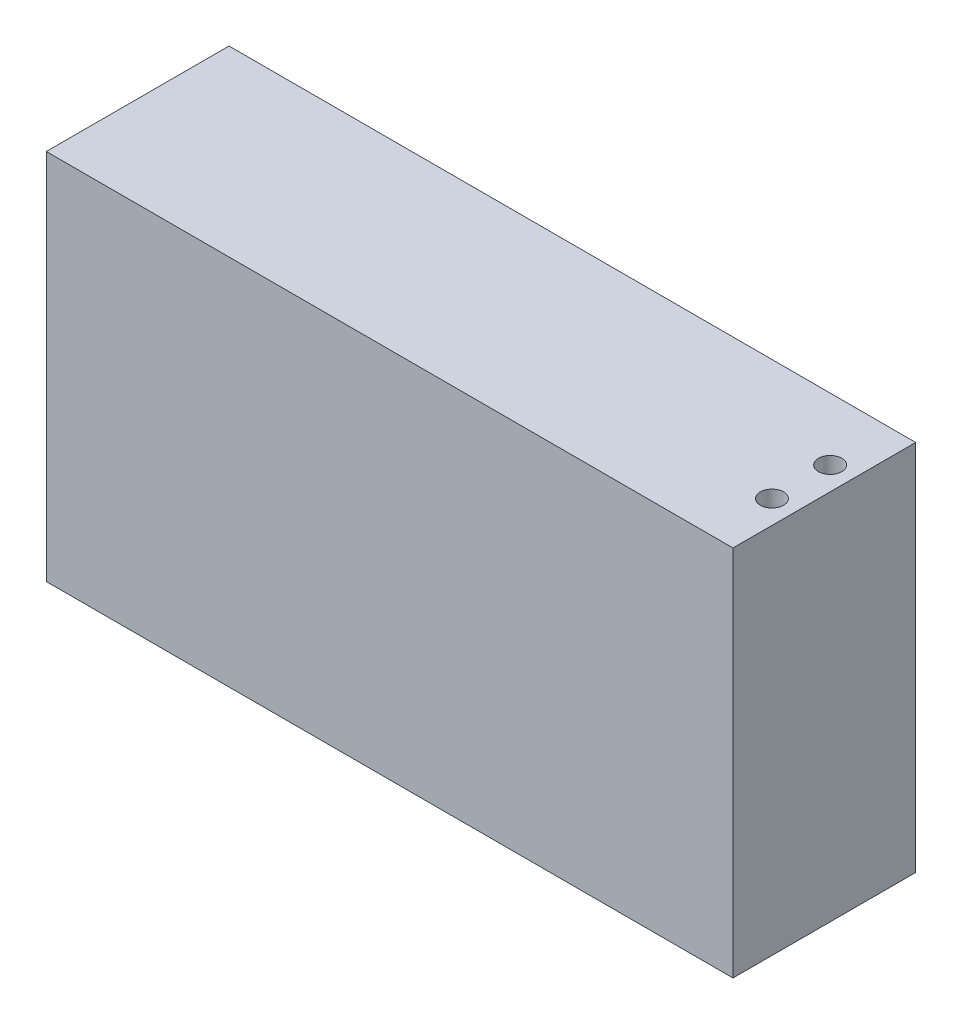
ISO-10303-21;
HEADER;
FILE_DESCRIPTION(('STEP AP214'),'2;1');
FILE_NAME('part.step','',(''),(''),'','','');
FILE_SCHEMA(('AUTOMOTIVE_DESIGN { 1 0 10303 214 1 1 1 1 }'));
ENDSEC;
DATA;
#1=APPLICATION_CONTEXT('core data for automotive mechanical design processes');
#2=APPLICATION_PROTOCOL_DEFINITION('international standard','automotive_design',2000,#1);
#3=PRODUCT_CONTEXT('',#1,'mechanical');
#4=PRODUCT('Part','Part','',(#3));
#5=PRODUCT_RELATED_PRODUCT_CATEGORY('part','',(#4));
#6=PRODUCT_DEFINITION_FORMATION('','',#4);
#7=PRODUCT_DEFINITION_CONTEXT('part definition',#1,'design');
#8=PRODUCT_DEFINITION('design','',#6,#7);
#9=PRODUCT_DEFINITION_SHAPE('','',#8);
#10=(LENGTH_UNIT() NAMED_UNIT(*) SI_UNIT(.MILLI.,.METRE.));
#11=(NAMED_UNIT(*) PLANE_ANGLE_UNIT() SI_UNIT($,.RADIAN.));
#12=(NAMED_UNIT(*) SI_UNIT($,.STERADIAN.) SOLID_ANGLE_UNIT());
#13=UNCERTAINTY_MEASURE_WITH_UNIT(LENGTH_MEASURE(1.E-05),#10,'distance_accuracy_value','');
#14=(GEOMETRIC_REPRESENTATION_CONTEXT(3) GLOBAL_UNCERTAINTY_ASSIGNED_CONTEXT((#13)) GLOBAL_UNIT_ASSIGNED_CONTEXT((#10,
#11,#12)) REPRESENTATION_CONTEXT('',''));
#15=CARTESIAN_POINT('',(0.,0.,0.));
#16=DIRECTION('',(0.,0.,1.));
#17=DIRECTION('',(1.,0.,0.));
#18=AXIS2_PLACEMENT_3D('',#15,#16,#17);
#19=CARTESIAN_POINT('',(0.,320.,0.));
#20=DIRECTION('',(-1.,0.,0.));
#21=DIRECTION('',(0.,0.,1.));
#22=AXIS2_PLACEMENT_3D('',#19,#20,#21);
#23=PLANE('',#22);
#24=DIRECTION('',(0.,0.,-1.));
#25=VECTOR('',#24,1.);
#26=CARTESIAN_POINT('',(0.,0.,0.));
#27=LINE('',#26,#25);
#28=CARTESIAN_POINT('',(0.,0.,0.));
#29=VERTEX_POINT('',#28);
#30=CARTESIAN_POINT('',(0.,0.,-157.));
#31=VERTEX_POINT('',#30);
#32=EDGE_CURVE('E113',#29,#31,#27,.T.);
#33=ORIENTED_EDGE('',*,*,#32,.F.);
#34=DIRECTION('',(0.,-1.,0.));
#35=VECTOR('',#34,1.);
#36=CARTESIAN_POINT('',(0.,320.,0.));
#37=LINE('',#36,#35);
#38=CARTESIAN_POINT('',(0.,320.,0.));
#39=VERTEX_POINT('',#38);
#40=EDGE_CURVE('E11',#39,#29,#37,.T.);
#41=ORIENTED_EDGE('',*,*,#40,.F.);
#42=DIRECTION('',(0.,0.,-1.));
#43=VECTOR('',#42,1.);
#44=CARTESIAN_POINT('',(0.,320.,0.));
#45=LINE('',#44,#43);
#46=CARTESIAN_POINT('',(0.,320.,-157.));
#47=VERTEX_POINT('',#46);
#48=EDGE_CURVE('E105',#39,#47,#45,.T.);
#49=ORIENTED_EDGE('',*,*,#48,.T.);
#50=DIRECTION('',(0.,-1.,0.));
#51=VECTOR('',#50,1.);
#52=CARTESIAN_POINT('',(0.,320.,-157.));
#53=LINE('',#52,#51);
#54=EDGE_CURVE('E44',#47,#31,#53,.T.);
#55=ORIENTED_EDGE('',*,*,#54,.T.);
#56=EDGE_LOOP('',(#33,#41,#49,#55));
#57=FACE_BOUND('',#56,.T.);
#58=ADVANCED_FACE('F41',(#57),#23,.T.);
#59=CARTESIAN_POINT('',(0.,320.,0.));
#60=DIRECTION('',(0.,0.,-1.));
#61=DIRECTION('',(-1.,0.,0.));
#62=AXIS2_PLACEMENT_3D('',#59,#60,#61);
#63=PLANE('',#62);
#64=DIRECTION('',(1.,0.,0.));
#65=VECTOR('',#64,1.);
#66=CARTESIAN_POINT('',(0.,0.,0.));
#67=LINE('',#66,#65);
#68=CARTESIAN_POINT('',(590.,0.,0.));
#69=VERTEX_POINT('',#68);
#70=EDGE_CURVE('E75',#29,#69,#67,.T.);
#71=ORIENTED_EDGE('',*,*,#70,.T.);
#72=DIRECTION('',(0.,-1.,0.));
#73=VECTOR('',#72,1.);
#74=CARTESIAN_POINT('',(590.,320.,0.));
#75=LINE('',#74,#73);
#76=CARTESIAN_POINT('',(590.,320.,0.));
#77=VERTEX_POINT('',#76);
#78=EDGE_CURVE('E51',#77,#69,#75,.T.);
#79=ORIENTED_EDGE('',*,*,#78,.F.);
#80=DIRECTION('',(1.,0.,0.));
#81=VECTOR('',#80,1.);
#82=CARTESIAN_POINT('',(0.,320.,0.));
#83=LINE('',#82,#81);
#84=EDGE_CURVE('E92',#39,#77,#83,.T.);
#85=ORIENTED_EDGE('',*,*,#84,.F.);
#86=ORIENTED_EDGE('',*,*,#40,.T.);
#87=EDGE_LOOP('',(#71,#79,#85,#86));
#88=FACE_BOUND('',#87,.T.);
#89=ADVANCED_FACE('F130',(#88),#63,.F.);
#90=CARTESIAN_POINT('',(590.,320.,0.));
#91=DIRECTION('',(-1.,0.,0.));
#92=DIRECTION('',(0.,0.,1.));
#93=AXIS2_PLACEMENT_3D('',#90,#91,#92);
#94=PLANE('',#93);
#95=DIRECTION('',(0.,0.,-1.));
#96=VECTOR('',#95,1.);
#97=CARTESIAN_POINT('',(590.,0.,0.));
#98=LINE('',#97,#96);
#99=CARTESIAN_POINT('',(590.,0.,-157.));
#100=VERTEX_POINT('',#99);
#101=EDGE_CURVE('E100',#69,#100,#98,.T.);
#102=ORIENTED_EDGE('',*,*,#101,.T.);
#103=DIRECTION('',(0.,-1.,0.));
#104=VECTOR('',#103,1.);
#105=CARTESIAN_POINT('',(590.,320.,-157.));
#106=LINE('',#105,#104);
#107=CARTESIAN_POINT('',(590.,320.,-157.));
#108=VERTEX_POINT('',#107);
#109=EDGE_CURVE('E97',#108,#100,#106,.T.);
#110=ORIENTED_EDGE('',*,*,#109,.F.);
#111=DIRECTION('',(0.,0.,-1.));
#112=VECTOR('',#111,1.);
#113=CARTESIAN_POINT('',(590.,320.,0.));
#114=LINE('',#113,#112);
#115=EDGE_CURVE('E87',#77,#108,#114,.T.);
#116=ORIENTED_EDGE('',*,*,#115,.F.);
#117=ORIENTED_EDGE('',*,*,#78,.T.);
#118=EDGE_LOOP('',(#102,#110,#116,#117));
#119=FACE_BOUND('',#118,.T.);
#120=ADVANCED_FACE('F98',(#119),#94,.F.);
#121=CARTESIAN_POINT('',(0.,320.,-157.));
#122=DIRECTION('',(0.,0.,-1.));
#123=DIRECTION('',(-1.,0.,0.));
#124=AXIS2_PLACEMENT_3D('',#121,#122,#123);
#125=PLANE('',#124);
#126=DIRECTION('',(1.,0.,0.));
#127=VECTOR('',#126,1.);
#128=CARTESIAN_POINT('',(0.,0.,-157.));
#129=LINE('',#128,#127);
#130=EDGE_CURVE('E117',#31,#100,#129,.T.);
#131=ORIENTED_EDGE('',*,*,#130,.F.);
#132=ORIENTED_EDGE('',*,*,#54,.F.);
#133=DIRECTION('',(1.,0.,0.));
#134=VECTOR('',#133,1.);
#135=CARTESIAN_POINT('',(0.,320.,-157.));
#136=LINE('',#135,#134);
#137=EDGE_CURVE('E91',#47,#108,#136,.T.);
#138=ORIENTED_EDGE('',*,*,#137,.T.);
#139=ORIENTED_EDGE('',*,*,#109,.T.);
#140=EDGE_LOOP('',(#131,#132,#138,#139));
#141=FACE_BOUND('',#140,.T.);
#142=ADVANCED_FACE('F103',(#141),#125,.T.);
#143=CARTESIAN_POINT('',(0.,320.,0.));
#144=DIRECTION('',(0.,-1.,0.));
#145=DIRECTION('',(0.,0.,-1.));
#146=AXIS2_PLACEMENT_3D('',#143,#144,#145);
#147=PLANE('',#146);
#148=CARTESIAN_POINT('',(570.,320.,-103.5));
#149=DIRECTION('',(0.,1.,0.));
#150=DIRECTION('',(0.,0.,1.));
#151=AXIS2_PLACEMENT_3D('',#148,#149,#150);
#152=CIRCLE('',#151,9.99999999999998);
#153=CARTESIAN_POINT('',(570.,320.,-93.5));
#154=VERTEX_POINT('',#153);
#155=EDGE_CURVE('E172',#154,#154,#152,.T.);
#156=ORIENTED_EDGE('',*,*,#155,.F.);
#157=EDGE_LOOP('',(#156));
#158=FACE_BOUND('',#157,.T.);
#159=CARTESIAN_POINT('',(570.,320.,-53.5));
#160=DIRECTION('',(0.,1.,0.));
#161=DIRECTION('',(0.,0.,1.));
#162=AXIS2_PLACEMENT_3D('',#159,#160,#161);
#163=CIRCLE('',#162,9.99999999999998);
#164=CARTESIAN_POINT('',(570.,320.,-43.5));
#165=VERTEX_POINT('',#164);
#166=EDGE_CURVE('E181',#165,#165,#163,.T.);
#167=ORIENTED_EDGE('',*,*,#166,.F.);
#168=EDGE_LOOP('',(#167));
#169=FACE_BOUND('',#168,.T.);
#170=ORIENTED_EDGE('',*,*,#48,.F.);
#171=ORIENTED_EDGE('',*,*,#84,.T.);
#172=ORIENTED_EDGE('',*,*,#115,.T.);
#173=ORIENTED_EDGE('',*,*,#137,.F.);
#174=EDGE_LOOP('',(#170,#171,#172,#173));
#175=FACE_BOUND('',#174,.T.);
#176=ADVANCED_FACE('F90',(#158,#169,#175),#147,.F.);
#177=CARTESIAN_POINT('',(0.,0.,0.));
#178=DIRECTION('',(0.,-1.,0.));
#179=DIRECTION('',(0.,0.,-1.));
#180=AXIS2_PLACEMENT_3D('',#177,#178,#179);
#181=PLANE('',#180);
#182=ORIENTED_EDGE('',*,*,#32,.T.);
#183=ORIENTED_EDGE('',*,*,#130,.T.);
#184=ORIENTED_EDGE('',*,*,#101,.F.);
#185=ORIENTED_EDGE('',*,*,#70,.F.);
#186=EDGE_LOOP('',(#182,#183,#184,#185));
#187=FACE_BOUND('',#186,.T.);
#188=ADVANCED_FACE('F127',(#187),#181,.T.);
#189=CARTESIAN_POINT('',(570.,240.,-53.5));
#190=DIRECTION('',(0.,1.,0.));
#191=DIRECTION('',(0.,0.,1.));
#192=AXIS2_PLACEMENT_3D('',#189,#190,#191);
#193=CYLINDRICAL_SURFACE('',#192,9.99999999999998);
#194=CARTESIAN_POINT('',(570.,240.,-53.5));
#195=DIRECTION('',(0.,1.,0.));
#196=DIRECTION('',(0.,0.,1.));
#197=AXIS2_PLACEMENT_3D('',#194,#195,#196);
#198=CIRCLE('',#197,9.99999999999998);
#199=CARTESIAN_POINT('',(570.,240.,-43.5));
#200=VERTEX_POINT('',#199);
#201=EDGE_CURVE('E176',#200,#200,#198,.T.);
#202=ORIENTED_EDGE('',*,*,#201,.F.);
#203=EDGE_LOOP('',(#202));
#204=FACE_BOUND('',#203,.T.);
#205=ORIENTED_EDGE('',*,*,#166,.T.);
#206=EDGE_LOOP('',(#205));
#207=FACE_BOUND('',#206,.T.);
#208=ADVANCED_FACE('F149',(#204,#207),#193,.F.);
#209=CARTESIAN_POINT('',(570.,240.,-53.5));
#210=DIRECTION('',(0.,1.,0.));
#211=DIRECTION('',(0.,0.,1.));
#212=AXIS2_PLACEMENT_3D('',#209,#210,#211);
#213=PLANE('',#212);
#214=ORIENTED_EDGE('',*,*,#201,.T.);
#215=EDGE_LOOP('',(#214));
#216=FACE_BOUND('',#215,.T.);
#217=ADVANCED_FACE('F155',(#216),#213,.T.);
#218=CARTESIAN_POINT('',(570.,240.,-103.5));
#219=DIRECTION('',(0.,1.,0.));
#220=DIRECTION('',(0.,0.,1.));
#221=AXIS2_PLACEMENT_3D('',#218,#219,#220);
#222=CYLINDRICAL_SURFACE('',#221,9.99999999999998);
#223=CARTESIAN_POINT('',(570.,240.,-103.5));
#224=DIRECTION('',(0.,1.,0.));
#225=DIRECTION('',(0.,0.,1.));
#226=AXIS2_PLACEMENT_3D('',#223,#224,#225);
#227=CIRCLE('',#226,9.99999999999998);
#228=CARTESIAN_POINT('',(570.,240.,-93.5));
#229=VERTEX_POINT('',#228);
#230=EDGE_CURVE('E118',#229,#229,#227,.T.);
#231=ORIENTED_EDGE('',*,*,#230,.F.);
#232=EDGE_LOOP('',(#231));
#233=FACE_BOUND('',#232,.T.);
#234=ORIENTED_EDGE('',*,*,#155,.T.);
#235=EDGE_LOOP('',(#234));
#236=FACE_BOUND('',#235,.T.);
#237=ADVANCED_FACE('F159',(#233,#236),#222,.F.);
#238=CARTESIAN_POINT('',(570.,240.,-103.5));
#239=DIRECTION('',(0.,1.,0.));
#240=DIRECTION('',(0.,0.,1.));
#241=AXIS2_PLACEMENT_3D('',#238,#239,#240);
#242=PLANE('',#241);
#243=ORIENTED_EDGE('',*,*,#230,.T.);
#244=EDGE_LOOP('',(#243));
#245=FACE_BOUND('',#244,.T.);
#246=ADVANCED_FACE('F163',(#245),#242,.T.);
#247=CLOSED_SHELL('',(#58,#89,#120,#142,#176,#188,#208,#217,#237,#246));
#248=MANIFOLD_SOLID_BREP('B2',#247);
#249=ADVANCED_BREP_SHAPE_REPRESENTATION('',(#18,#248),#14);
#250=SHAPE_DEFINITION_REPRESENTATION(#9,#249);
ENDSEC;
END-ISO-10303-21;
